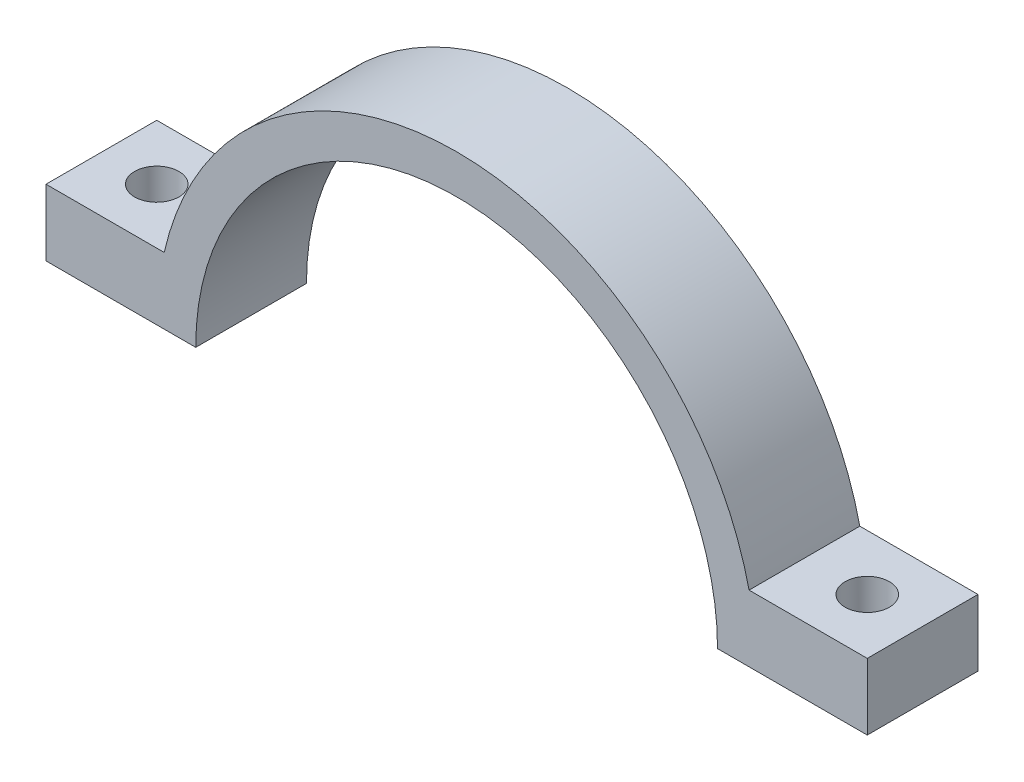
ISO-10303-21;
HEADER;
FILE_DESCRIPTION(('STEP AP214'),'2;1');
FILE_NAME('part.step','',(''),(''),'','','');
FILE_SCHEMA(('AUTOMOTIVE_DESIGN { 1 0 10303 214 1 1 1 1 }'));
ENDSEC;
DATA;
#1=APPLICATION_CONTEXT('core data for automotive mechanical design processes');
#2=APPLICATION_PROTOCOL_DEFINITION('international standard','automotive_design',2000,#1);
#3=PRODUCT_CONTEXT('',#1,'mechanical');
#4=PRODUCT('Part','Part','',(#3));
#5=PRODUCT_RELATED_PRODUCT_CATEGORY('part','',(#4));
#6=PRODUCT_DEFINITION_FORMATION('','',#4);
#7=PRODUCT_DEFINITION_CONTEXT('part definition',#1,'design');
#8=PRODUCT_DEFINITION('design','',#6,#7);
#9=PRODUCT_DEFINITION_SHAPE('','',#8);
#10=(LENGTH_UNIT() NAMED_UNIT(*) SI_UNIT(.MILLI.,.METRE.));
#11=(NAMED_UNIT(*) PLANE_ANGLE_UNIT() SI_UNIT($,.RADIAN.));
#12=(NAMED_UNIT(*) SI_UNIT($,.STERADIAN.) SOLID_ANGLE_UNIT());
#13=UNCERTAINTY_MEASURE_WITH_UNIT(LENGTH_MEASURE(1.E-05),#10,'distance_accuracy_value','');
#14=(GEOMETRIC_REPRESENTATION_CONTEXT(3) GLOBAL_UNCERTAINTY_ASSIGNED_CONTEXT((#13)) GLOBAL_UNIT_ASSIGNED_CONTEXT((#10,
#11,#12)) REPRESENTATION_CONTEXT('',''));
#15=CARTESIAN_POINT('',(0.,0.,0.));
#16=DIRECTION('',(0.,0.,1.));
#17=DIRECTION('',(1.,0.,0.));
#18=AXIS2_PLACEMENT_3D('',#15,#16,#17);
#19=CARTESIAN_POINT('',(-18.54,0.,5.));
#20=DIRECTION('',(1.,0.,0.));
#21=DIRECTION('',(0.,0.,-1.));
#22=AXIS2_PLACEMENT_3D('',#19,#20,#21);
#23=PLANE('',#22);
#24=DIRECTION('',(0.,-1.,0.));
#25=VECTOR('',#24,1.);
#26=CARTESIAN_POINT('',(-18.54,0.,0.));
#27=LINE('',#26,#25);
#28=CARTESIAN_POINT('',(-18.54,3.,0.));
#29=VERTEX_POINT('',#28);
#30=CARTESIAN_POINT('',(-18.54,0.,0.));
#31=VERTEX_POINT('',#30);
#32=EDGE_CURVE('E128',#29,#31,#27,.T.);
#33=ORIENTED_EDGE('',*,*,#32,.T.);
#34=DIRECTION('',(0.,0.,-1.));
#35=VECTOR('',#34,1.);
#36=CARTESIAN_POINT('',(-18.54,0.,5.));
#37=LINE('',#36,#35);
#38=CARTESIAN_POINT('',(-18.54,0.,5.));
#39=VERTEX_POINT('',#38);
#40=EDGE_CURVE('E11',#39,#31,#37,.T.);
#41=ORIENTED_EDGE('',*,*,#40,.F.);
#42=DIRECTION('',(0.,-1.,0.));
#43=VECTOR('',#42,1.);
#44=CARTESIAN_POINT('',(-18.54,0.,5.));
#45=LINE('',#44,#43);
#46=CARTESIAN_POINT('',(-18.54,3.,5.));
#47=VERTEX_POINT('',#46);
#48=EDGE_CURVE('E144',#47,#39,#45,.T.);
#49=ORIENTED_EDGE('',*,*,#48,.F.);
#50=DIRECTION('',(0.,0.,-1.));
#51=VECTOR('',#50,1.);
#52=CARTESIAN_POINT('',(-18.54,3.,5.));
#53=LINE('',#52,#51);
#54=EDGE_CURVE('E124',#47,#29,#53,.T.);
#55=ORIENTED_EDGE('',*,*,#54,.T.);
#56=EDGE_LOOP('',(#33,#41,#49,#55));
#57=FACE_BOUND('',#56,.T.);
#58=ADVANCED_FACE('F32',(#57),#23,.F.);
#59=CARTESIAN_POINT('',(-11.78,0.,5.));
#60=DIRECTION('',(0.,1.,0.));
#61=DIRECTION('',(0.,0.,1.));
#62=AXIS2_PLACEMENT_3D('',#59,#60,#61);
#63=PLANE('',#62);
#64=CARTESIAN_POINT('',(-16.04,0.,2.5));
#65=DIRECTION('',(0.,1.,0.));
#66=DIRECTION('',(0.,0.,1.));
#67=AXIS2_PLACEMENT_3D('',#64,#65,#66);
#68=CIRCLE('',#67,1.);
#69=CARTESIAN_POINT('',(-16.04,0.,3.5));
#70=VERTEX_POINT('',#69);
#71=EDGE_CURVE('E178',#70,#70,#68,.T.);
#72=ORIENTED_EDGE('',*,*,#71,.T.);
#73=EDGE_LOOP('',(#72));
#74=FACE_BOUND('',#73,.T.);
#75=DIRECTION('',(1.,0.,0.));
#76=VECTOR('',#75,1.);
#77=CARTESIAN_POINT('',(-11.78,0.,0.));
#78=LINE('',#77,#76);
#79=CARTESIAN_POINT('',(-11.78,0.,0.));
#80=VERTEX_POINT('',#79);
#81=EDGE_CURVE('E131',#31,#80,#78,.T.);
#82=ORIENTED_EDGE('',*,*,#81,.T.);
#83=DIRECTION('',(0.,0.,-1.));
#84=VECTOR('',#83,1.);
#85=CARTESIAN_POINT('',(-11.78,0.,5.));
#86=LINE('',#85,#84);
#87=CARTESIAN_POINT('',(-11.78,0.,5.));
#88=VERTEX_POINT('',#87);
#89=EDGE_CURVE('E40',#88,#80,#86,.T.);
#90=ORIENTED_EDGE('',*,*,#89,.F.);
#91=DIRECTION('',(1.,0.,0.));
#92=VECTOR('',#91,1.);
#93=CARTESIAN_POINT('',(-13.54,0.,5.));
#94=LINE('',#93,#92);
#95=EDGE_CURVE('E91',#39,#88,#94,.T.);
#96=ORIENTED_EDGE('',*,*,#95,.F.);
#97=ORIENTED_EDGE('',*,*,#40,.T.);
#98=EDGE_LOOP('',(#82,#90,#96,#97));
#99=FACE_BOUND('',#98,.T.);
#100=ADVANCED_FACE('F202',(#74,#99),#63,.F.);
#101=CARTESIAN_POINT('',(0.,0.,5.));
#102=DIRECTION('',(0.,0.,-1.));
#103=DIRECTION('',(-1.,0.,0.));
#104=AXIS2_PLACEMENT_3D('',#101,#102,#103);
#105=CYLINDRICAL_SURFACE('',#104,11.78);
#106=CARTESIAN_POINT('',(0.,0.,0.));
#107=DIRECTION('',(0.,0.,-1.));
#108=DIRECTION('',(1.,0.,0.));
#109=AXIS2_PLACEMENT_3D('',#106,#107,#108);
#110=CIRCLE('',#109,11.78);
#111=CARTESIAN_POINT('',(11.78,0.,0.));
#112=VERTEX_POINT('',#111);
#113=EDGE_CURVE('E134',#80,#112,#110,.T.);
#114=ORIENTED_EDGE('',*,*,#113,.T.);
#115=DIRECTION('',(0.,0.,-1.));
#116=VECTOR('',#115,1.);
#117=CARTESIAN_POINT('',(11.78,0.,5.));
#118=LINE('',#117,#116);
#119=CARTESIAN_POINT('',(11.78,0.,5.));
#120=VERTEX_POINT('',#119);
#121=EDGE_CURVE('E151',#120,#112,#118,.T.);
#122=ORIENTED_EDGE('',*,*,#121,.F.);
#123=CARTESIAN_POINT('',(0.,0.,5.));
#124=DIRECTION('',(0.,0.,-1.));
#125=DIRECTION('',(1.,0.,0.));
#126=AXIS2_PLACEMENT_3D('',#123,#124,#125);
#127=CIRCLE('',#126,11.78);
#128=EDGE_CURVE('E159',#88,#120,#127,.T.);
#129=ORIENTED_EDGE('',*,*,#128,.F.);
#130=ORIENTED_EDGE('',*,*,#89,.T.);
#131=EDGE_LOOP('',(#114,#122,#129,#130));
#132=FACE_BOUND('',#131,.T.);
#133=ADVANCED_FACE('F157',(#132),#105,.F.);
#134=CARTESIAN_POINT('',(13.54,0.,5.));
#135=DIRECTION('',(0.,1.,0.));
#136=DIRECTION('',(0.,0.,1.));
#137=AXIS2_PLACEMENT_3D('',#134,#135,#136);
#138=PLANE('',#137);
#139=CARTESIAN_POINT('',(16.04,0.,2.5));
#140=DIRECTION('',(0.,1.,0.));
#141=DIRECTION('',(0.,0.,1.));
#142=AXIS2_PLACEMENT_3D('',#139,#140,#141);
#143=CIRCLE('',#142,1.);
#144=CARTESIAN_POINT('',(16.04,0.,3.5));
#145=VERTEX_POINT('',#144);
#146=EDGE_CURVE('E132',#145,#145,#143,.T.);
#147=ORIENTED_EDGE('',*,*,#146,.T.);
#148=EDGE_LOOP('',(#147));
#149=FACE_BOUND('',#148,.T.);
#150=DIRECTION('',(1.,0.,0.));
#151=VECTOR('',#150,1.);
#152=CARTESIAN_POINT('',(13.54,0.,0.));
#153=LINE('',#152,#151);
#154=CARTESIAN_POINT('',(18.54,0.,0.));
#155=VERTEX_POINT('',#154);
#156=EDGE_CURVE('E137',#112,#155,#153,.T.);
#157=ORIENTED_EDGE('',*,*,#156,.T.);
#158=DIRECTION('',(0.,0.,-1.));
#159=VECTOR('',#158,1.);
#160=CARTESIAN_POINT('',(18.54,0.,5.));
#161=LINE('',#160,#159);
#162=CARTESIAN_POINT('',(18.54,0.,5.));
#163=VERTEX_POINT('',#162);
#164=EDGE_CURVE('E148',#163,#155,#161,.T.);
#165=ORIENTED_EDGE('',*,*,#164,.F.);
#166=DIRECTION('',(1.,0.,0.));
#167=VECTOR('',#166,1.);
#168=CARTESIAN_POINT('',(13.54,0.,5.));
#169=LINE('',#168,#167);
#170=EDGE_CURVE('E170',#120,#163,#169,.T.);
#171=ORIENTED_EDGE('',*,*,#170,.F.);
#172=ORIENTED_EDGE('',*,*,#121,.T.);
#173=EDGE_LOOP('',(#157,#165,#171,#172));
#174=FACE_BOUND('',#173,.T.);
#175=ADVANCED_FACE('F166',(#149,#174),#138,.F.);
#176=CARTESIAN_POINT('',(18.54,0.,5.));
#177=DIRECTION('',(-1.,0.,0.));
#178=DIRECTION('',(0.,0.,1.));
#179=AXIS2_PLACEMENT_3D('',#176,#177,#178);
#180=PLANE('',#179);
#181=DIRECTION('',(0.,1.,0.));
#182=VECTOR('',#181,1.);
#183=CARTESIAN_POINT('',(18.54,0.,0.));
#184=LINE('',#183,#182);
#185=CARTESIAN_POINT('',(18.54,3.,0.));
#186=VERTEX_POINT('',#185);
#187=EDGE_CURVE('E139',#155,#186,#184,.T.);
#188=ORIENTED_EDGE('',*,*,#187,.T.);
#189=DIRECTION('',(0.,0.,-1.));
#190=VECTOR('',#189,1.);
#191=CARTESIAN_POINT('',(18.54,3.,5.));
#192=LINE('',#191,#190);
#193=CARTESIAN_POINT('',(18.54,3.,5.));
#194=VERTEX_POINT('',#193);
#195=EDGE_CURVE('E119',#194,#186,#192,.T.);
#196=ORIENTED_EDGE('',*,*,#195,.F.);
#197=DIRECTION('',(0.,1.,0.));
#198=VECTOR('',#197,1.);
#199=CARTESIAN_POINT('',(18.54,0.,5.));
#200=LINE('',#199,#198);
#201=EDGE_CURVE('E110',#163,#194,#200,.T.);
#202=ORIENTED_EDGE('',*,*,#201,.F.);
#203=ORIENTED_EDGE('',*,*,#164,.T.);
#204=EDGE_LOOP('',(#188,#196,#202,#203));
#205=FACE_BOUND('',#204,.T.);
#206=ADVANCED_FACE('F169',(#205),#180,.F.);
#207=CARTESIAN_POINT('',(18.54,3.,5.));
#208=DIRECTION('',(0.,-1.,0.));
#209=DIRECTION('',(0.,0.,-1.));
#210=AXIS2_PLACEMENT_3D('',#207,#208,#209);
#211=PLANE('',#210);
#212=CARTESIAN_POINT('',(16.04,3.,2.5));
#213=DIRECTION('',(0.,1.,0.));
#214=DIRECTION('',(0.,0.,-1.));
#215=AXIS2_PLACEMENT_3D('',#212,#213,#214);
#216=CIRCLE('',#215,1.);
#217=CARTESIAN_POINT('',(16.04,3.,1.5));
#218=VERTEX_POINT('',#217);
#219=EDGE_CURVE('E182',#218,#218,#216,.T.);
#220=ORIENTED_EDGE('',*,*,#219,.F.);
#221=EDGE_LOOP('',(#220));
#222=FACE_BOUND('',#221,.T.);
#223=DIRECTION('',(-1.,0.,0.));
#224=VECTOR('',#223,1.);
#225=CARTESIAN_POINT('',(18.54,3.,0.));
#226=LINE('',#225,#224);
#227=CARTESIAN_POINT('',(13.2034692410745,3.,0.));
#228=VERTEX_POINT('',#227);
#229=EDGE_CURVE('E118',#186,#228,#226,.T.);
#230=ORIENTED_EDGE('',*,*,#229,.T.);
#231=DIRECTION('',(0.,0.,-1.));
#232=VECTOR('',#231,1.);
#233=CARTESIAN_POINT('',(13.2034692410745,3.,5.));
#234=LINE('',#233,#232);
#235=CARTESIAN_POINT('',(13.2034692410745,3.,5.));
#236=VERTEX_POINT('',#235);
#237=EDGE_CURVE('E115',#236,#228,#234,.T.);
#238=ORIENTED_EDGE('',*,*,#237,.F.);
#239=DIRECTION('',(-1.,0.,0.));
#240=VECTOR('',#239,1.);
#241=CARTESIAN_POINT('',(18.54,3.,5.));
#242=LINE('',#241,#240);
#243=EDGE_CURVE('E104',#194,#236,#242,.T.);
#244=ORIENTED_EDGE('',*,*,#243,.F.);
#245=ORIENTED_EDGE('',*,*,#195,.T.);
#246=EDGE_LOOP('',(#230,#238,#244,#245));
#247=FACE_BOUND('',#246,.T.);
#248=ADVANCED_FACE('F116',(#222,#247),#211,.F.);
#249=CARTESIAN_POINT('',(0.,0.,5.));
#250=DIRECTION('',(0.,0.,-1.));
#251=DIRECTION('',(-1.,0.,0.));
#252=AXIS2_PLACEMENT_3D('',#249,#250,#251);
#253=CYLINDRICAL_SURFACE('',#252,13.54);
#254=CARTESIAN_POINT('',(0.,0.,0.));
#255=DIRECTION('',(0.,0.,1.));
#256=DIRECTION('',(1.,0.,0.));
#257=AXIS2_PLACEMENT_3D('',#254,#255,#256);
#258=CIRCLE('',#257,13.54);
#259=CARTESIAN_POINT('',(-13.2034692410745,3.,0.));
#260=VERTEX_POINT('',#259);
#261=EDGE_CURVE('E77',#228,#260,#258,.T.);
#262=ORIENTED_EDGE('',*,*,#261,.T.);
#263=DIRECTION('',(0.,0.,-1.));
#264=VECTOR('',#263,1.);
#265=CARTESIAN_POINT('',(-13.2034692410745,3.,5.));
#266=LINE('',#265,#264);
#267=CARTESIAN_POINT('',(-13.2034692410745,3.,5.));
#268=VERTEX_POINT('',#267);
#269=EDGE_CURVE('E120',#268,#260,#266,.T.);
#270=ORIENTED_EDGE('',*,*,#269,.F.);
#271=CARTESIAN_POINT('',(0.,0.,5.));
#272=DIRECTION('',(0.,0.,1.));
#273=DIRECTION('',(1.,0.,0.));
#274=AXIS2_PLACEMENT_3D('',#271,#272,#273);
#275=CIRCLE('',#274,13.54);
#276=EDGE_CURVE('E108',#236,#268,#275,.T.);
#277=ORIENTED_EDGE('',*,*,#276,.F.);
#278=ORIENTED_EDGE('',*,*,#237,.T.);
#279=EDGE_LOOP('',(#262,#270,#277,#278));
#280=FACE_BOUND('',#279,.T.);
#281=ADVANCED_FACE('F122',(#280),#253,.T.);
#282=CARTESIAN_POINT('',(-18.54,3.,5.));
#283=DIRECTION('',(0.,-1.,0.));
#284=DIRECTION('',(0.,0.,-1.));
#285=AXIS2_PLACEMENT_3D('',#282,#283,#284);
#286=PLANE('',#285);
#287=CARTESIAN_POINT('',(-16.04,3.,2.5));
#288=DIRECTION('',(0.,1.,0.));
#289=DIRECTION('',(0.,0.,1.));
#290=AXIS2_PLACEMENT_3D('',#287,#288,#289);
#291=CIRCLE('',#290,1.);
#292=CARTESIAN_POINT('',(-16.04,3.,3.5));
#293=VERTEX_POINT('',#292);
#294=EDGE_CURVE('E181',#293,#293,#291,.T.);
#295=ORIENTED_EDGE('',*,*,#294,.F.);
#296=EDGE_LOOP('',(#295));
#297=FACE_BOUND('',#296,.T.);
#298=DIRECTION('',(-1.,0.,0.));
#299=VECTOR('',#298,1.);
#300=CARTESIAN_POINT('',(-18.54,3.,0.));
#301=LINE('',#300,#299);
#302=EDGE_CURVE('E83',#260,#29,#301,.T.);
#303=ORIENTED_EDGE('',*,*,#302,.T.);
#304=ORIENTED_EDGE('',*,*,#54,.F.);
#305=DIRECTION('',(-1.,0.,0.));
#306=VECTOR('',#305,1.);
#307=CARTESIAN_POINT('',(-18.54,3.,5.));
#308=LINE('',#307,#306);
#309=EDGE_CURVE('E48',#268,#47,#308,.T.);
#310=ORIENTED_EDGE('',*,*,#309,.F.);
#311=ORIENTED_EDGE('',*,*,#269,.T.);
#312=EDGE_LOOP('',(#303,#304,#310,#311));
#313=FACE_BOUND('',#312,.T.);
#314=ADVANCED_FACE('F191',(#297,#313),#286,.F.);
#315=CARTESIAN_POINT('',(0.,0.,5.));
#316=DIRECTION('',(0.,0.,1.));
#317=DIRECTION('',(1.,0.,0.));
#318=AXIS2_PLACEMENT_3D('',#315,#316,#317);
#319=PLANE('',#318);
#320=ORIENTED_EDGE('',*,*,#48,.T.);
#321=ORIENTED_EDGE('',*,*,#95,.T.);
#322=ORIENTED_EDGE('',*,*,#128,.T.);
#323=ORIENTED_EDGE('',*,*,#170,.T.);
#324=ORIENTED_EDGE('',*,*,#201,.T.);
#325=ORIENTED_EDGE('',*,*,#243,.T.);
#326=ORIENTED_EDGE('',*,*,#276,.T.);
#327=ORIENTED_EDGE('',*,*,#309,.T.);
#328=EDGE_LOOP('',(#320,#321,#322,#323,#324,#325,#326,#327));
#329=FACE_BOUND('',#328,.T.);
#330=ADVANCED_FACE('F106',(#329),#319,.T.);
#331=CARTESIAN_POINT('',(0.,0.,0.));
#332=DIRECTION('',(0.,0.,1.));
#333=DIRECTION('',(1.,0.,0.));
#334=AXIS2_PLACEMENT_3D('',#331,#332,#333);
#335=PLANE('',#334);
#336=ORIENTED_EDGE('',*,*,#32,.F.);
#337=ORIENTED_EDGE('',*,*,#302,.F.);
#338=ORIENTED_EDGE('',*,*,#261,.F.);
#339=ORIENTED_EDGE('',*,*,#229,.F.);
#340=ORIENTED_EDGE('',*,*,#187,.F.);
#341=ORIENTED_EDGE('',*,*,#156,.F.);
#342=ORIENTED_EDGE('',*,*,#113,.F.);
#343=ORIENTED_EDGE('',*,*,#81,.F.);
#344=EDGE_LOOP('',(#336,#337,#338,#339,#340,#341,#342,#343));
#345=FACE_BOUND('',#344,.T.);
#346=ADVANCED_FACE('F162',(#345),#335,.F.);
#347=CARTESIAN_POINT('',(-16.04,-2.,2.5));
#348=DIRECTION('',(0.,1.,0.));
#349=DIRECTION('',(0.,0.,1.));
#350=AXIS2_PLACEMENT_3D('',#347,#348,#349);
#351=CYLINDRICAL_SURFACE('',#350,1.);
#352=ORIENTED_EDGE('',*,*,#294,.T.);
#353=EDGE_LOOP('',(#352));
#354=FACE_BOUND('',#353,.T.);
#355=ORIENTED_EDGE('',*,*,#71,.F.);
#356=EDGE_LOOP('',(#355));
#357=FACE_BOUND('',#356,.T.);
#358=ADVANCED_FACE('F188',(#354,#357),#351,.F.);
#359=CARTESIAN_POINT('',(16.04,-2.,2.5));
#360=DIRECTION('',(0.,1.,0.));
#361=DIRECTION('',(0.,0.,1.));
#362=AXIS2_PLACEMENT_3D('',#359,#360,#361);
#363=CYLINDRICAL_SURFACE('',#362,1.);
#364=ORIENTED_EDGE('',*,*,#219,.T.);
#365=EDGE_LOOP('',(#364));
#366=FACE_BOUND('',#365,.T.);
#367=ORIENTED_EDGE('',*,*,#146,.F.);
#368=EDGE_LOOP('',(#367));
#369=FACE_BOUND('',#368,.T.);
#370=ADVANCED_FACE('F226',(#366,#369),#363,.F.);
#371=CLOSED_SHELL('',(#58,#100,#133,#175,#206,#248,#281,#314,#330,#346,#358,#370));
#372=MANIFOLD_SOLID_BREP('B2',#371);
#373=ADVANCED_BREP_SHAPE_REPRESENTATION('',(#18,#372),#14);
#374=SHAPE_DEFINITION_REPRESENTATION(#9,#373);
ENDSEC;
END-ISO-10303-21;
